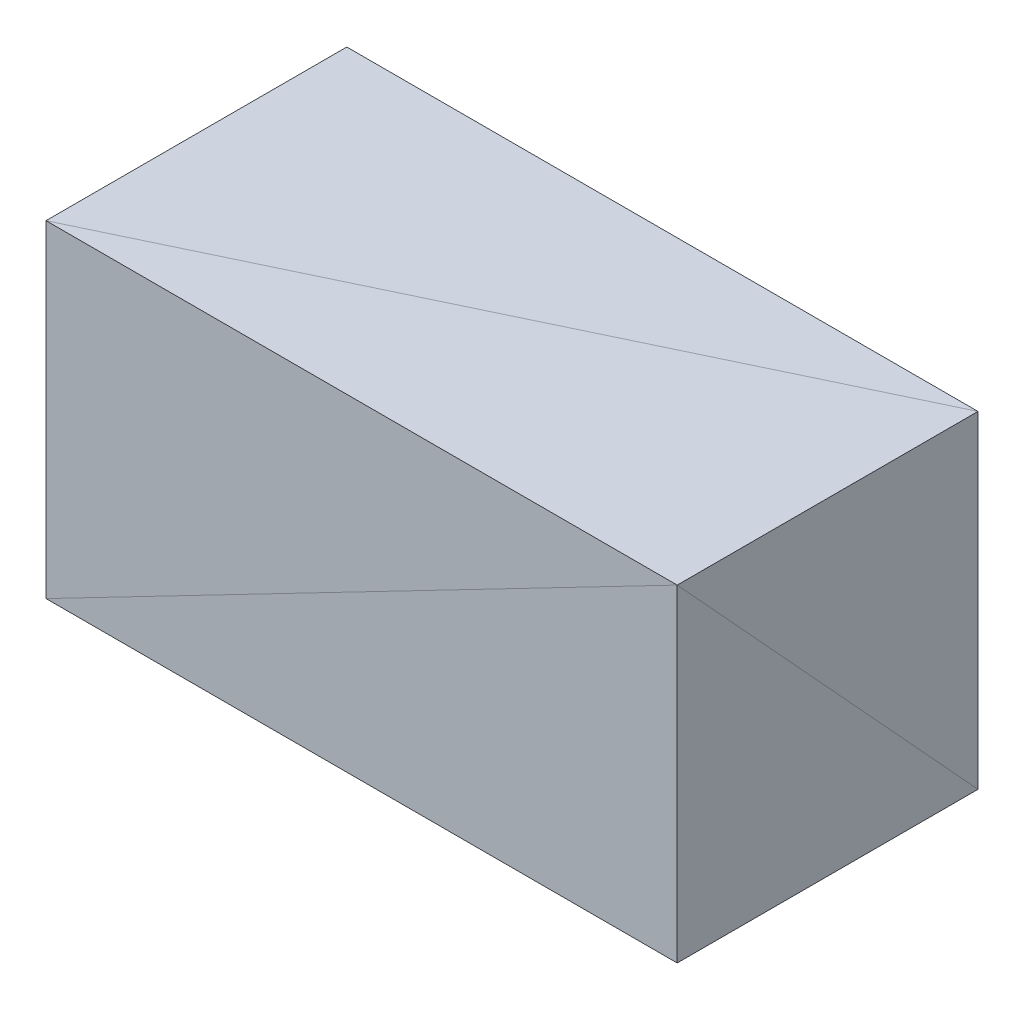
ISO-10303-21;
HEADER;
FILE_DESCRIPTION(('STEP AP214'),'2;1');
FILE_NAME('part.step','',(''),(''),'','','');
FILE_SCHEMA(('AUTOMOTIVE_DESIGN { 1 0 10303 214 1 1 1 1 }'));
ENDSEC;
DATA;
#1=APPLICATION_CONTEXT('core data for automotive mechanical design processes');
#2=APPLICATION_PROTOCOL_DEFINITION('international standard','automotive_design',2000,#1);
#3=PRODUCT_CONTEXT('',#1,'mechanical');
#4=PRODUCT('Part','Part','',(#3));
#5=PRODUCT_RELATED_PRODUCT_CATEGORY('part','',(#4));
#6=PRODUCT_DEFINITION_FORMATION('','',#4);
#7=PRODUCT_DEFINITION_CONTEXT('part definition',#1,'design');
#8=PRODUCT_DEFINITION('design','',#6,#7);
#9=PRODUCT_DEFINITION_SHAPE('','',#8);
#10=(LENGTH_UNIT() NAMED_UNIT(*) SI_UNIT(.MILLI.,.METRE.));
#11=(NAMED_UNIT(*) PLANE_ANGLE_UNIT() SI_UNIT($,.RADIAN.));
#12=(NAMED_UNIT(*) SI_UNIT($,.STERADIAN.) SOLID_ANGLE_UNIT());
#13=UNCERTAINTY_MEASURE_WITH_UNIT(LENGTH_MEASURE(1.E-05),#10,'distance_accuracy_value','');
#14=(GEOMETRIC_REPRESENTATION_CONTEXT(3) GLOBAL_UNCERTAINTY_ASSIGNED_CONTEXT((#13)) GLOBAL_UNIT_ASSIGNED_CONTEXT((#10,
#11,#12)) REPRESENTATION_CONTEXT('',''));
#15=CARTESIAN_POINT('',(0.,0.,0.));
#16=DIRECTION('',(0.,0.,1.));
#17=DIRECTION('',(1.,0.,0.));
#18=AXIS2_PLACEMENT_3D('',#15,#16,#17);
#19=CARTESIAN_POINT('',(-4.90526676178,1.079666694005,4.90299987793));
#20=DIRECTION('',(0.,0.,-1.));
#21=DIRECTION('',(0.,-1.,0.));
#22=AXIS2_PLACEMENT_3D('',#19,#20,#21);
#23=PLANE('',#22);
#24=CARTESIAN_POINT('',(5.381766637166,6.413333257039,4.90299987793));
#25=DIRECTION('',(-1.,0.,0.));
#26=VECTOR('',#25,1.);
#27=LINE('',#24,#26);
#28=CARTESIAN_POINT('',(5.38176663716599,6.41341654459618,4.90299987792983));
#29=VERTEX_POINT('',#28);
#30=CARTESIAN_POINT('',(-4.90526676178022,6.413416544596,4.90299987792954));
#31=VERTEX_POINT('',#30);
#32=EDGE_CURVE('E61',#29,#31,#27,.T.);
#33=ORIENTED_EDGE('',*,*,#32,.T.);
#34=CARTESIAN_POINT('',(-4.90526676178,6.413333257039,4.90299987793));
#35=DIRECTION('',(0.,-1.,0.));
#36=VECTOR('',#35,1.);
#37=LINE('',#34,#36);
#38=CARTESIAN_POINT('',(-4.90526676177999,1.07958336671182,4.90299987792983));
#39=VERTEX_POINT('',#38);
#40=EDGE_CURVE('E65',#31,#39,#37,.T.);
#41=ORIENTED_EDGE('',*,*,#40,.T.);
#42=CARTESIAN_POINT('',(-4.90526676178,1.079666694005,4.90299987793));
#43=DIRECTION('',(0.887766900927879,0.460293308246937,0.));
#44=VECTOR('',#43,1.);
#45=LINE('',#42,#44);
#46=EDGE_CURVE('E58',#39,#29,#45,.T.);
#47=ORIENTED_EDGE('',*,*,#46,.T.);
#48=EDGE_LOOP('',(#33,#41,#47));
#49=FACE_BOUND('',#48,.T.);
#50=ADVANCED_FACE('F16',(#49),#23,.F.);
#51=CARTESIAN_POINT('',(-4.90526676178,1.079666694005,4.90299987793));
#52=DIRECTION('',(0.,0.,-1.));
#53=DIRECTION('',(0.,-1.,0.));
#54=AXIS2_PLACEMENT_3D('',#51,#52,#53);
#55=PLANE('',#54);
#56=CARTESIAN_POINT('',(5.381766637166,1.079666694005,4.90299987793));
#57=DIRECTION('',(0.,1.,0.));
#58=VECTOR('',#57,1.);
#59=LINE('',#56,#58);
#60=CARTESIAN_POINT('',(5.38176663716622,1.079583366712,4.90299987792954));
#61=VERTEX_POINT('',#60);
#62=EDGE_CURVE('E71',#61,#29,#59,.T.);
#63=ORIENTED_EDGE('',*,*,#62,.T.);
#64=ORIENTED_EDGE('',*,*,#46,.F.);
#65=CARTESIAN_POINT('',(-4.90526676178,1.079666694005,4.90299987793));
#66=DIRECTION('',(1.,0.,0.));
#67=VECTOR('',#66,1.);
#68=LINE('',#65,#67);
#69=EDGE_CURVE('E77',#39,#61,#68,.T.);
#70=ORIENTED_EDGE('',*,*,#69,.T.);
#71=EDGE_LOOP('',(#63,#64,#70));
#72=FACE_BOUND('',#71,.T.);
#73=ADVANCED_FACE('F76',(#72),#55,.F.);
#74=CARTESIAN_POINT('',(5.381766637166,1.079500039419,4.90299987793));
#75=DIRECTION('',(-1.,0.,0.));
#76=DIRECTION('',(0.,0.,1.));
#77=AXIS2_PLACEMENT_3D('',#74,#75,#76);
#78=PLANE('',#77);
#79=CARTESIAN_POINT('',(5.381766637166,1.079500039419,0.00100000000869023));
#80=DIRECTION('',(0.,0.736294058048826,0.67666170283384));
#81=VECTOR('',#80,1.);
#82=LINE('',#79,#81);
#83=CARTESIAN_POINT('',(5.381766637166,1.07958336671184,0.00100000000886337));
#84=VERTEX_POINT('',#83);
#85=EDGE_CURVE('E86',#84,#29,#82,.T.);
#86=ORIENTED_EDGE('',*,*,#85,.T.);
#87=ORIENTED_EDGE('',*,*,#62,.F.);
#88=CARTESIAN_POINT('',(5.381766637166,1.079500039419,4.90299987793));
#89=DIRECTION('',(0.,0.,-1.));
#90=VECTOR('',#89,1.);
#91=LINE('',#88,#90);
#92=EDGE_CURVE('E89',#61,#84,#91,.T.);
#93=ORIENTED_EDGE('',*,*,#92,.T.);
#94=EDGE_LOOP('',(#86,#87,#93));
#95=FACE_BOUND('',#94,.T.);
#96=ADVANCED_FACE('F88',(#95),#78,.F.);
#97=CARTESIAN_POINT('',(5.381766637166,6.413499832153,4.90299987793));
#98=DIRECTION('',(0.,-1.,0.));
#99=DIRECTION('',(0.,0.,-1.));
#100=AXIS2_PLACEMENT_3D('',#97,#98,#99);
#101=PLANE('',#100);
#102=CARTESIAN_POINT('',(5.381766637166,6.413499832153,0.00100000000869023));
#103=DIRECTION('',(-0.90274424062889,0.,0.430177679582948));
#104=VECTOR('',#103,1.);
#105=LINE('',#102,#104);
#106=CARTESIAN_POINT('',(5.38176663716621,6.41341654459603,0.00100000000915162));
#107=VERTEX_POINT('',#106);
#108=EDGE_CURVE('E105',#107,#31,#105,.T.);
#109=ORIENTED_EDGE('',*,*,#108,.T.);
#110=ORIENTED_EDGE('',*,*,#32,.F.);
#111=CARTESIAN_POINT('',(5.381766637166,6.413499832153,4.90299987793));
#112=DIRECTION('',(0.,0.,-1.));
#113=VECTOR('',#112,1.);
#114=LINE('',#111,#113);
#115=EDGE_CURVE('E97',#29,#107,#114,.T.);
#116=ORIENTED_EDGE('',*,*,#115,.T.);
#117=EDGE_LOOP('',(#109,#110,#116));
#118=FACE_BOUND('',#117,.T.);
#119=ADVANCED_FACE('F102',(#118),#101,.F.);
#120=CARTESIAN_POINT('',(-4.90526676178,6.413499832153,4.90299987793));
#121=DIRECTION('',(1.,0.,0.));
#122=DIRECTION('',(0.,1.,0.));
#123=AXIS2_PLACEMENT_3D('',#120,#121,#122);
#124=PLANE('',#123);
#125=CARTESIAN_POINT('',(-4.90526676178,6.413499832153,0.00100000000869023));
#126=DIRECTION('',(0.,-0.736294058048826,0.67666170283384));
#127=VECTOR('',#126,1.);
#128=LINE('',#125,#127);
#129=CARTESIAN_POINT('',(-4.90526676178,6.41341654459616,0.00100000000886337));
#130=VERTEX_POINT('',#129);
#131=EDGE_CURVE('E214',#130,#39,#128,.T.);
#132=ORIENTED_EDGE('',*,*,#131,.T.);
#133=ORIENTED_EDGE('',*,*,#40,.F.);
#134=CARTESIAN_POINT('',(-4.90526676178,6.413499832153,4.90299987793));
#135=DIRECTION('',(0.,0.,-1.));
#136=VECTOR('',#135,1.);
#137=LINE('',#134,#136);
#138=EDGE_CURVE('E204',#31,#130,#137,.T.);
#139=ORIENTED_EDGE('',*,*,#138,.T.);
#140=EDGE_LOOP('',(#132,#133,#139));
#141=FACE_BOUND('',#140,.T.);
#142=ADVANCED_FACE('F183',(#141),#124,.F.);
#143=CARTESIAN_POINT('',(-4.90526676178,1.079500039419,4.90299987793));
#144=DIRECTION('',(0.,1.,0.));
#145=DIRECTION('',(1.,0.,0.));
#146=AXIS2_PLACEMENT_3D('',#143,#144,#145);
#147=PLANE('',#146);
#148=CARTESIAN_POINT('',(-4.90526676178,1.079500039419,0.00100000000869023));
#149=DIRECTION('',(0.90274424062889,0.,0.430177679582948));
#150=VECTOR('',#149,1.);
#151=LINE('',#148,#150);
#152=CARTESIAN_POINT('',(-4.90526676178021,1.07958336671197,0.00100000000915162));
#153=VERTEX_POINT('',#152);
#154=EDGE_CURVE('E116',#153,#61,#151,.T.);
#155=ORIENTED_EDGE('',*,*,#154,.T.);
#156=ORIENTED_EDGE('',*,*,#69,.F.);
#157=CARTESIAN_POINT('',(-4.90526676178,1.079500039419,4.90299987793));
#158=DIRECTION('',(0.,0.,-1.));
#159=VECTOR('',#158,1.);
#160=LINE('',#157,#159);
#161=EDGE_CURVE('E36',#39,#153,#160,.T.);
#162=ORIENTED_EDGE('',*,*,#161,.T.);
#163=EDGE_LOOP('',(#155,#156,#162));
#164=FACE_BOUND('',#163,.T.);
#165=ADVANCED_FACE('F135',(#164),#147,.F.);
#166=CARTESIAN_POINT('',(5.381766637166,1.079500039419,0.001000000008692));
#167=DIRECTION('',(-1.,0.,0.));
#168=DIRECTION('',(0.,0.,1.));
#169=AXIS2_PLACEMENT_3D('',#166,#167,#168);
#170=PLANE('',#169);
#171=ORIENTED_EDGE('',*,*,#115,.F.);
#172=ORIENTED_EDGE('',*,*,#85,.F.);
#173=CARTESIAN_POINT('',(5.381766637166,1.079500039419,0.001000000008692));
#174=DIRECTION('',(0.,1.,0.));
#175=VECTOR('',#174,1.);
#176=LINE('',#173,#175);
#177=EDGE_CURVE('E113',#84,#107,#176,.T.);
#178=ORIENTED_EDGE('',*,*,#177,.T.);
#179=EDGE_LOOP('',(#171,#172,#178));
#180=FACE_BOUND('',#179,.T.);
#181=ADVANCED_FACE('F111',(#180),#170,.F.);
#182=CARTESIAN_POINT('',(-4.90526676178,1.079500039419,0.001000000008692));
#183=DIRECTION('',(0.,1.,0.));
#184=DIRECTION('',(1.,0.,0.));
#185=AXIS2_PLACEMENT_3D('',#182,#183,#184);
#186=PLANE('',#185);
#187=ORIENTED_EDGE('',*,*,#92,.F.);
#188=ORIENTED_EDGE('',*,*,#154,.F.);
#189=CARTESIAN_POINT('',(-4.90526676178,1.079500039419,0.001000000008692));
#190=DIRECTION('',(1.,0.,0.));
#191=VECTOR('',#190,1.);
#192=LINE('',#189,#191);
#193=EDGE_CURVE('E228',#153,#84,#192,.T.);
#194=ORIENTED_EDGE('',*,*,#193,.T.);
#195=EDGE_LOOP('',(#187,#188,#194));
#196=FACE_BOUND('',#195,.T.);
#197=ADVANCED_FACE('F134',(#196),#186,.F.);
#198=CARTESIAN_POINT('',(5.381766637166,6.413499832153,0.001000000008692));
#199=DIRECTION('',(0.,-1.,0.));
#200=DIRECTION('',(0.,0.,-1.));
#201=AXIS2_PLACEMENT_3D('',#198,#199,#200);
#202=PLANE('',#201);
#203=ORIENTED_EDGE('',*,*,#138,.F.);
#204=ORIENTED_EDGE('',*,*,#108,.F.);
#205=CARTESIAN_POINT('',(5.381766637166,6.413499832153,0.001000000008692));
#206=DIRECTION('',(-1.,0.,0.));
#207=VECTOR('',#206,1.);
#208=LINE('',#205,#207);
#209=EDGE_CURVE('E219',#107,#130,#208,.T.);
#210=ORIENTED_EDGE('',*,*,#209,.T.);
#211=EDGE_LOOP('',(#203,#204,#210));
#212=FACE_BOUND('',#211,.T.);
#213=ADVANCED_FACE('F221',(#212),#202,.F.);
#214=CARTESIAN_POINT('',(-4.90526676178,6.413499832153,0.001000000008692));
#215=DIRECTION('',(1.,0.,0.));
#216=DIRECTION('',(0.,1.,0.));
#217=AXIS2_PLACEMENT_3D('',#214,#215,#216);
#218=PLANE('',#217);
#219=ORIENTED_EDGE('',*,*,#161,.F.);
#220=ORIENTED_EDGE('',*,*,#131,.F.);
#221=CARTESIAN_POINT('',(-4.90526676178,6.413499832153,0.001000000008692));
#222=DIRECTION('',(0.,-1.,0.));
#223=VECTOR('',#222,1.);
#224=LINE('',#221,#223);
#225=EDGE_CURVE('E28',#130,#153,#224,.T.);
#226=ORIENTED_EDGE('',*,*,#225,.T.);
#227=EDGE_LOOP('',(#219,#220,#226));
#228=FACE_BOUND('',#227,.T.);
#229=ADVANCED_FACE('F234',(#228),#218,.F.);
#230=CARTESIAN_POINT('',(5.381766637166,1.079666694005,0.001000000008692));
#231=DIRECTION('',(0.,0.,1.));
#232=DIRECTION('',(1.,0.,0.));
#233=AXIS2_PLACEMENT_3D('',#230,#231,#232);
#234=PLANE('',#233);
#235=CARTESIAN_POINT('',(-4.90526676178,1.079666694005,0.001000000008692));
#236=DIRECTION('',(0.887766900927879,0.460293308246937,0.));
#237=VECTOR('',#236,1.);
#238=LINE('',#235,#237);
#239=EDGE_CURVE('E11',#153,#107,#238,.T.);
#240=ORIENTED_EDGE('',*,*,#239,.T.);
#241=ORIENTED_EDGE('',*,*,#177,.F.);
#242=ORIENTED_EDGE('',*,*,#193,.F.);
#243=EDGE_LOOP('',(#240,#241,#242));
#244=FACE_BOUND('',#243,.T.);
#245=ADVANCED_FACE('F261',(#244),#234,.F.);
#246=CARTESIAN_POINT('',(5.381766637166,6.413333257039,0.001000000008692));
#247=DIRECTION('',(0.,0.,1.));
#248=DIRECTION('',(1.,0.,0.));
#249=AXIS2_PLACEMENT_3D('',#246,#247,#248);
#250=PLANE('',#249);
#251=ORIENTED_EDGE('',*,*,#225,.F.);
#252=ORIENTED_EDGE('',*,*,#209,.F.);
#253=ORIENTED_EDGE('',*,*,#239,.F.);
#254=EDGE_LOOP('',(#251,#252,#253));
#255=FACE_BOUND('',#254,.T.);
#256=ADVANCED_FACE('F242',(#255),#250,.F.);
#257=CLOSED_SHELL('',(#50,#73,#96,#119,#142,#165,#181,#197,#213,#229,#245,#256));
#258=MANIFOLD_SOLID_BREP('B1',#257);
#259=ADVANCED_BREP_SHAPE_REPRESENTATION('',(#18,#258),#14);
#260=SHAPE_DEFINITION_REPRESENTATION(#9,#259);
ENDSEC;
END-ISO-10303-21;
